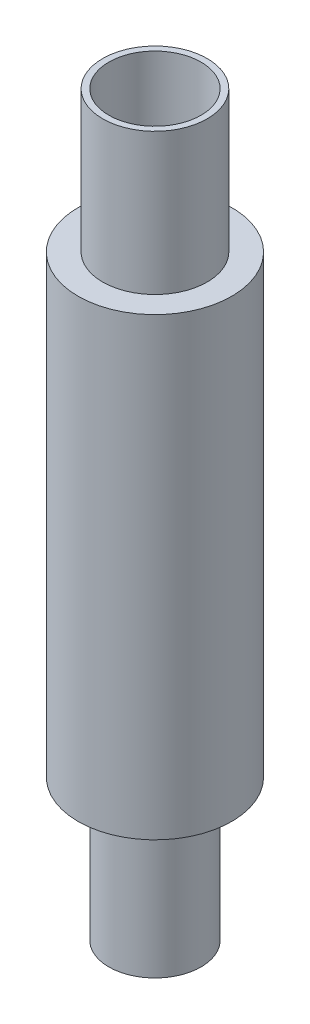
ISO-10303-21;
HEADER;
FILE_DESCRIPTION(('STEP AP214'),'2;1');
FILE_NAME('part.step','',(''),(''),'','','');
FILE_SCHEMA(('AUTOMOTIVE_DESIGN { 1 0 10303 214 1 1 1 1 }'));
ENDSEC;
DATA;
#1=APPLICATION_CONTEXT('core data for automotive mechanical design processes');
#2=APPLICATION_PROTOCOL_DEFINITION('international standard','automotive_design',2000,#1);
#3=PRODUCT_CONTEXT('',#1,'mechanical');
#4=PRODUCT('Part','Part','',(#3));
#5=PRODUCT_RELATED_PRODUCT_CATEGORY('part','',(#4));
#6=PRODUCT_DEFINITION_FORMATION('','',#4);
#7=PRODUCT_DEFINITION_CONTEXT('part definition',#1,'design');
#8=PRODUCT_DEFINITION('design','',#6,#7);
#9=PRODUCT_DEFINITION_SHAPE('','',#8);
#10=(LENGTH_UNIT() NAMED_UNIT(*) SI_UNIT(.MILLI.,.METRE.));
#11=(NAMED_UNIT(*) PLANE_ANGLE_UNIT() SI_UNIT($,.RADIAN.));
#12=(NAMED_UNIT(*) SI_UNIT($,.STERADIAN.) SOLID_ANGLE_UNIT());
#13=UNCERTAINTY_MEASURE_WITH_UNIT(LENGTH_MEASURE(1.E-05),#10,'distance_accuracy_value','');
#14=(GEOMETRIC_REPRESENTATION_CONTEXT(3) GLOBAL_UNCERTAINTY_ASSIGNED_CONTEXT((#13)) GLOBAL_UNIT_ASSIGNED_CONTEXT((#10,
#11,#12)) REPRESENTATION_CONTEXT('',''));
#15=CARTESIAN_POINT('',(0.,0.,0.));
#16=DIRECTION('',(0.,0.,1.));
#17=DIRECTION('',(1.,0.,0.));
#18=AXIS2_PLACEMENT_3D('',#15,#16,#17);
#19=CARTESIAN_POINT('',(0.,97.,0.));
#20=DIRECTION('',(0.,1.,0.));
#21=DIRECTION('',(0.,0.,1.));
#22=AXIS2_PLACEMENT_3D('',#19,#20,#21);
#23=PLANE('',#22);
#24=CARTESIAN_POINT('',(0.,97.,0.));
#25=DIRECTION('',(0.,1.,0.));
#26=DIRECTION('',(0.,0.,1.));
#27=AXIS2_PLACEMENT_3D('',#24,#25,#26);
#28=CIRCLE('',#27,12.5);
#29=CARTESIAN_POINT('',(0.,97.,12.5));
#30=VERTEX_POINT('',#29);
#31=EDGE_CURVE('E73',#30,#30,#28,.T.);
#32=ORIENTED_EDGE('',*,*,#31,.T.);
#33=EDGE_LOOP('',(#32));
#34=FACE_BOUND('',#33,.T.);
#35=CARTESIAN_POINT('',(0.,97.,0.));
#36=DIRECTION('',(0.,1.,0.));
#37=DIRECTION('',(0.,0.,1.));
#38=AXIS2_PLACEMENT_3D('',#35,#36,#37);
#39=CIRCLE('',#38,8.5);
#40=CARTESIAN_POINT('',(0.,97.,8.5));
#41=VERTEX_POINT('',#40);
#42=EDGE_CURVE('E82',#41,#41,#39,.T.);
#43=ORIENTED_EDGE('',*,*,#42,.F.);
#44=EDGE_LOOP('',(#43));
#45=FACE_BOUND('',#44,.T.);
#46=ADVANCED_FACE('F37',(#34,#45),#23,.T.);
#47=CARTESIAN_POINT('',(0.,25.,0.));
#48=DIRECTION('',(0.,1.,0.));
#49=DIRECTION('',(0.,0.,1.));
#50=AXIS2_PLACEMENT_3D('',#47,#48,#49);
#51=PLANE('',#50);
#52=CARTESIAN_POINT('',(0.,25.,0.));
#53=DIRECTION('',(0.,1.,0.));
#54=DIRECTION('',(0.,0.,1.));
#55=AXIS2_PLACEMENT_3D('',#52,#53,#54);
#56=CIRCLE('',#55,6.5);
#57=CARTESIAN_POINT('',(0.,25.,6.5));
#58=VERTEX_POINT('',#57);
#59=EDGE_CURVE('E65',#58,#58,#56,.T.);
#60=ORIENTED_EDGE('',*,*,#59,.F.);
#61=EDGE_LOOP('',(#60));
#62=FACE_BOUND('',#61,.T.);
#63=CARTESIAN_POINT('',(0.,25.,0.));
#64=DIRECTION('',(0.,1.,0.));
#65=DIRECTION('',(0.,0.,1.));
#66=AXIS2_PLACEMENT_3D('',#63,#64,#65);
#67=CIRCLE('',#66,11.);
#68=CARTESIAN_POINT('',(0.,25.,11.));
#69=VERTEX_POINT('',#68);
#70=EDGE_CURVE('E10',#69,#69,#67,.F.);
#71=ORIENTED_EDGE('',*,*,#70,.F.);
#72=EDGE_LOOP('',(#71));
#73=FACE_BOUND('',#72,.T.);
#74=ADVANCED_FACE('F111',(#62,#73),#51,.T.);
#75=CARTESIAN_POINT('',(0.,0.,0.));
#76=DIRECTION('',(0.,1.,0.));
#77=DIRECTION('',(0.,0.,1.));
#78=AXIS2_PLACEMENT_3D('',#75,#76,#77);
#79=PLANE('',#78);
#80=CARTESIAN_POINT('',(0.,0.,0.));
#81=DIRECTION('',(0.,1.,0.));
#82=DIRECTION('',(0.,0.,1.));
#83=AXIS2_PLACEMENT_3D('',#80,#81,#82);
#84=CIRCLE('',#83,7.5);
#85=CARTESIAN_POINT('',(0.,0.,7.5));
#86=VERTEX_POINT('',#85);
#87=EDGE_CURVE('E50',#86,#86,#84,.T.);
#88=ORIENTED_EDGE('',*,*,#87,.F.);
#89=EDGE_LOOP('',(#88));
#90=FACE_BOUND('',#89,.T.);
#91=CARTESIAN_POINT('',(0.,0.,0.));
#92=DIRECTION('',(0.,1.,0.));
#93=DIRECTION('',(0.,0.,1.));
#94=AXIS2_PLACEMENT_3D('',#91,#92,#93);
#95=CIRCLE('',#94,6.5);
#96=CARTESIAN_POINT('',(0.,0.,6.5));
#97=VERTEX_POINT('',#96);
#98=EDGE_CURVE('E56',#97,#97,#95,.T.);
#99=ORIENTED_EDGE('',*,*,#98,.T.);
#100=EDGE_LOOP('',(#99));
#101=FACE_BOUND('',#100,.T.);
#102=ADVANCED_FACE('F117',(#90,#101),#79,.F.);
#103=CARTESIAN_POINT('',(0.,23.,0.));
#104=DIRECTION('',(0.,-1.,0.));
#105=DIRECTION('',(0.,0.,-1.));
#106=AXIS2_PLACEMENT_3D('',#103,#104,#105);
#107=CYLINDRICAL_SURFACE('',#106,7.5);
#108=CARTESIAN_POINT('',(0.,23.,0.));
#109=DIRECTION('',(0.,1.,0.));
#110=DIRECTION('',(0.,0.,1.));
#111=AXIS2_PLACEMENT_3D('',#108,#109,#110);
#112=CIRCLE('',#111,7.5);
#113=CARTESIAN_POINT('',(0.,23.,7.5));
#114=VERTEX_POINT('',#113);
#115=EDGE_CURVE('E45',#114,#114,#112,.T.);
#116=ORIENTED_EDGE('',*,*,#115,.F.);
#117=EDGE_LOOP('',(#116));
#118=FACE_BOUND('',#117,.T.);
#119=ORIENTED_EDGE('',*,*,#87,.T.);
#120=EDGE_LOOP('',(#119));
#121=FACE_BOUND('',#120,.T.);
#122=ADVANCED_FACE('F39',(#118,#121),#107,.T.);
#123=CARTESIAN_POINT('',(0.,23.,0.));
#124=DIRECTION('',(0.,-1.,0.));
#125=DIRECTION('',(0.,0.,-1.));
#126=AXIS2_PLACEMENT_3D('',#123,#124,#125);
#127=CYLINDRICAL_SURFACE('',#126,6.5);
#128=ORIENTED_EDGE('',*,*,#98,.F.);
#129=EDGE_LOOP('',(#128));
#130=FACE_BOUND('',#129,.T.);
#131=ORIENTED_EDGE('',*,*,#59,.T.);
#132=EDGE_LOOP('',(#131));
#133=FACE_BOUND('',#132,.T.);
#134=ADVANCED_FACE('F133',(#130,#133),#127,.F.);
#135=CARTESIAN_POINT('',(0.,23.,0.));
#136=DIRECTION('',(0.,1.,0.));
#137=DIRECTION('',(0.,0.,1.));
#138=AXIS2_PLACEMENT_3D('',#135,#136,#137);
#139=PLANE('',#138);
#140=ORIENTED_EDGE('',*,*,#115,.T.);
#141=EDGE_LOOP('',(#140));
#142=FACE_BOUND('',#141,.T.);
#143=CARTESIAN_POINT('',(0.,23.,0.));
#144=DIRECTION('',(0.,1.,0.));
#145=DIRECTION('',(0.,0.,1.));
#146=AXIS2_PLACEMENT_3D('',#143,#144,#145);
#147=CIRCLE('',#146,12.5);
#148=CARTESIAN_POINT('',(0.,23.,12.5));
#149=VERTEX_POINT('',#148);
#150=EDGE_CURVE('E61',#149,#149,#147,.T.);
#151=ORIENTED_EDGE('',*,*,#150,.F.);
#152=EDGE_LOOP('',(#151));
#153=FACE_BOUND('',#152,.T.);
#154=ADVANCED_FACE('F130',(#142,#153),#139,.F.);
#155=CARTESIAN_POINT('',(0.,25.,0.));
#156=DIRECTION('',(0.,-1.,0.));
#157=DIRECTION('',(0.,0.,-1.));
#158=AXIS2_PLACEMENT_3D('',#155,#156,#157);
#159=CYLINDRICAL_SURFACE('',#158,12.5);
#160=ORIENTED_EDGE('',*,*,#150,.T.);
#161=EDGE_LOOP('',(#160));
#162=FACE_BOUND('',#161,.T.);
#163=ORIENTED_EDGE('',*,*,#31,.F.);
#164=EDGE_LOOP('',(#163));
#165=FACE_BOUND('',#164,.T.);
#166=ADVANCED_FACE('F127',(#162,#165),#159,.T.);
#167=CARTESIAN_POINT('',(0.,95.,0.));
#168=DIRECTION('',(0.,-1.,0.));
#169=DIRECTION('',(0.,0.,-1.));
#170=AXIS2_PLACEMENT_3D('',#167,#168,#169);
#171=CYLINDRICAL_SURFACE('',#170,11.);
#172=CARTESIAN_POINT('',(0.,95.,0.));
#173=DIRECTION('',(0.,1.,0.));
#174=DIRECTION('',(0.,0.,1.));
#175=AXIS2_PLACEMENT_3D('',#172,#173,#174);
#176=CIRCLE('',#175,11.);
#177=CARTESIAN_POINT('',(0.,95.,11.));
#178=VERTEX_POINT('',#177);
#179=EDGE_CURVE('E69',#178,#178,#176,.T.);
#180=ORIENTED_EDGE('',*,*,#179,.T.);
#181=EDGE_LOOP('',(#180));
#182=FACE_BOUND('',#181,.T.);
#183=ORIENTED_EDGE('',*,*,#70,.T.);
#184=EDGE_LOOP('',(#183));
#185=FACE_BOUND('',#184,.T.);
#186=ADVANCED_FACE('F124',(#182,#185),#171,.F.);
#187=CARTESIAN_POINT('',(0.,95.,0.));
#188=DIRECTION('',(0.,1.,0.));
#189=DIRECTION('',(0.,0.,1.));
#190=AXIS2_PLACEMENT_3D('',#187,#188,#189);
#191=PLANE('',#190);
#192=CARTESIAN_POINT('',(0.,95.,0.));
#193=DIRECTION('',(0.,1.,0.));
#194=DIRECTION('',(0.,0.,1.));
#195=AXIS2_PLACEMENT_3D('',#192,#193,#194);
#196=CIRCLE('',#195,7.5);
#197=CARTESIAN_POINT('',(0.,95.,7.5));
#198=VERTEX_POINT('',#197);
#199=EDGE_CURVE('E77',#198,#198,#196,.T.);
#200=ORIENTED_EDGE('',*,*,#199,.T.);
#201=EDGE_LOOP('',(#200));
#202=FACE_BOUND('',#201,.T.);
#203=ORIENTED_EDGE('',*,*,#179,.F.);
#204=EDGE_LOOP('',(#203));
#205=FACE_BOUND('',#204,.T.);
#206=ADVANCED_FACE('F107',(#202,#205),#191,.F.);
#207=CARTESIAN_POINT('',(0.,97.,0.));
#208=DIRECTION('',(0.,-1.,0.));
#209=DIRECTION('',(0.,0.,-1.));
#210=AXIS2_PLACEMENT_3D('',#207,#208,#209);
#211=CYLINDRICAL_SURFACE('',#210,7.5);
#212=ORIENTED_EDGE('',*,*,#199,.F.);
#213=EDGE_LOOP('',(#212));
#214=FACE_BOUND('',#213,.T.);
#215=CARTESIAN_POINT('',(0.,120.,0.));
#216=DIRECTION('',(0.,1.,0.));
#217=DIRECTION('',(0.,0.,1.));
#218=AXIS2_PLACEMENT_3D('',#215,#216,#217);
#219=CIRCLE('',#218,7.5);
#220=CARTESIAN_POINT('',(0.,120.,7.5));
#221=VERTEX_POINT('',#220);
#222=EDGE_CURVE('E86',#221,#221,#219,.T.);
#223=ORIENTED_EDGE('',*,*,#222,.T.);
#224=EDGE_LOOP('',(#223));
#225=FACE_BOUND('',#224,.T.);
#226=ADVANCED_FACE('F94',(#214,#225),#211,.F.);
#227=CARTESIAN_POINT('',(0.,120.,0.));
#228=DIRECTION('',(0.,1.,0.));
#229=DIRECTION('',(0.,0.,1.));
#230=AXIS2_PLACEMENT_3D('',#227,#228,#229);
#231=PLANE('',#230);
#232=CARTESIAN_POINT('',(0.,120.,0.));
#233=DIRECTION('',(0.,1.,0.));
#234=DIRECTION('',(0.,0.,1.));
#235=AXIS2_PLACEMENT_3D('',#232,#233,#234);
#236=CIRCLE('',#235,8.5);
#237=CARTESIAN_POINT('',(0.,120.,8.5));
#238=VERTEX_POINT('',#237);
#239=EDGE_CURVE('E81',#238,#238,#236,.T.);
#240=ORIENTED_EDGE('',*,*,#239,.T.);
#241=EDGE_LOOP('',(#240));
#242=FACE_BOUND('',#241,.T.);
#243=ORIENTED_EDGE('',*,*,#222,.F.);
#244=EDGE_LOOP('',(#243));
#245=FACE_BOUND('',#244,.T.);
#246=ADVANCED_FACE('F96',(#242,#245),#231,.T.);
#247=CARTESIAN_POINT('',(0.,120.,0.));
#248=DIRECTION('',(0.,-1.,0.));
#249=DIRECTION('',(0.,0.,-1.));
#250=AXIS2_PLACEMENT_3D('',#247,#248,#249);
#251=CYLINDRICAL_SURFACE('',#250,8.5);
#252=ORIENTED_EDGE('',*,*,#239,.F.);
#253=EDGE_LOOP('',(#252));
#254=FACE_BOUND('',#253,.T.);
#255=ORIENTED_EDGE('',*,*,#42,.T.);
#256=EDGE_LOOP('',(#255));
#257=FACE_BOUND('',#256,.T.);
#258=ADVANCED_FACE('F98',(#254,#257),#251,.T.);
#259=CLOSED_SHELL('',(#46,#74,#102,#122,#134,#154,#166,#186,#206,#226,#246,#258));
#260=MANIFOLD_SOLID_BREP('B2',#259);
#261=ADVANCED_BREP_SHAPE_REPRESENTATION('',(#18,#260),#14);
#262=SHAPE_DEFINITION_REPRESENTATION(#9,#261);
ENDSEC;
END-ISO-10303-21;
